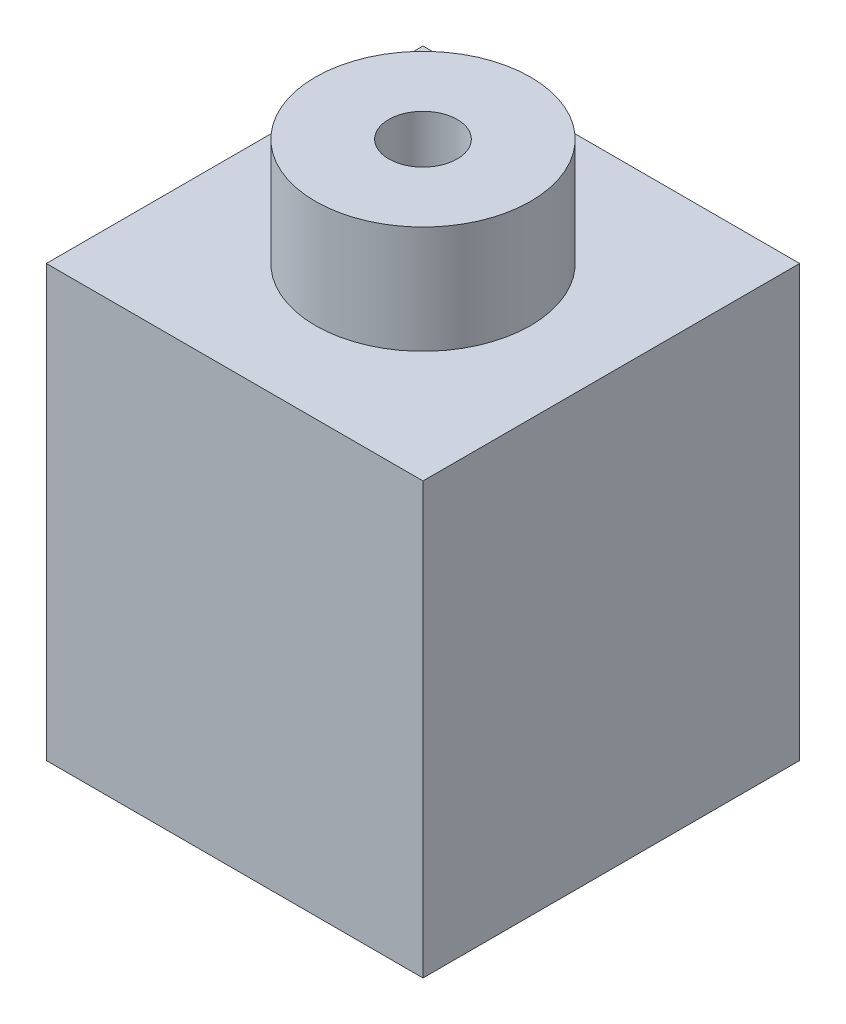
ISO-10303-21;
HEADER;
FILE_DESCRIPTION(('STEP AP214'),'2;1');
FILE_NAME('part.step','',(''),(''),'','','');
FILE_SCHEMA(('AUTOMOTIVE_DESIGN { 1 0 10303 214 1 1 1 1 }'));
ENDSEC;
DATA;
#1=APPLICATION_CONTEXT('core data for automotive mechanical design processes');
#2=APPLICATION_PROTOCOL_DEFINITION('international standard','automotive_design',2000,#1);
#3=PRODUCT_CONTEXT('',#1,'mechanical');
#4=PRODUCT('Part','Part','',(#3));
#5=PRODUCT_RELATED_PRODUCT_CATEGORY('part','',(#4));
#6=PRODUCT_DEFINITION_FORMATION('','',#4);
#7=PRODUCT_DEFINITION_CONTEXT('part definition',#1,'design');
#8=PRODUCT_DEFINITION('design','',#6,#7);
#9=PRODUCT_DEFINITION_SHAPE('','',#8);
#10=(LENGTH_UNIT() NAMED_UNIT(*) SI_UNIT(.MILLI.,.METRE.));
#11=(NAMED_UNIT(*) PLANE_ANGLE_UNIT() SI_UNIT($,.RADIAN.));
#12=(NAMED_UNIT(*) SI_UNIT($,.STERADIAN.) SOLID_ANGLE_UNIT());
#13=UNCERTAINTY_MEASURE_WITH_UNIT(LENGTH_MEASURE(1.E-05),#10,'distance_accuracy_value','');
#14=(GEOMETRIC_REPRESENTATION_CONTEXT(3) GLOBAL_UNCERTAINTY_ASSIGNED_CONTEXT((#13)) GLOBAL_UNIT_ASSIGNED_CONTEXT((#10,
#11,#12)) REPRESENTATION_CONTEXT('',''));
#15=CARTESIAN_POINT('',(0.,0.,0.));
#16=DIRECTION('',(0.,0.,1.));
#17=DIRECTION('',(1.,0.,0.));
#18=AXIS2_PLACEMENT_3D('',#15,#16,#17);
#19=CARTESIAN_POINT('',(0.,25.4,0.));
#20=DIRECTION('',(0.,-1.,0.));
#21=DIRECTION('',(0.,0.,-1.));
#22=AXIS2_PLACEMENT_3D('',#19,#20,#21);
#23=PLANE('',#22);
#24=DIRECTION('',(0.,0.,-1.));
#25=VECTOR('',#24,1.);
#26=CARTESIAN_POINT('',(11.1125,25.4,11.1125));
#27=LINE('',#26,#25);
#28=CARTESIAN_POINT('',(11.1125,25.4,11.1125));
#29=VERTEX_POINT('',#28);
#30=CARTESIAN_POINT('',(11.1125,25.4,-11.1125));
#31=VERTEX_POINT('',#30);
#32=EDGE_CURVE('E149',#29,#31,#27,.T.);
#33=ORIENTED_EDGE('',*,*,#32,.T.);
#34=DIRECTION('',(-1.,0.,0.));
#35=VECTOR('',#34,1.);
#36=CARTESIAN_POINT('',(-11.1125,25.4,-11.1125));
#37=LINE('',#36,#35);
#38=CARTESIAN_POINT('',(-11.1125,25.4,-11.1125));
#39=VERTEX_POINT('',#38);
#40=EDGE_CURVE('E90',#31,#39,#37,.T.);
#41=ORIENTED_EDGE('',*,*,#40,.T.);
#42=DIRECTION('',(0.,0.,1.));
#43=VECTOR('',#42,1.);
#44=CARTESIAN_POINT('',(-11.1125,25.4,11.1125));
#45=LINE('',#44,#43);
#46=CARTESIAN_POINT('',(-11.1125,25.4,11.1125));
#47=VERTEX_POINT('',#46);
#48=EDGE_CURVE('E152',#39,#47,#45,.T.);
#49=ORIENTED_EDGE('',*,*,#48,.T.);
#50=DIRECTION('',(1.,0.,0.));
#51=VECTOR('',#50,1.);
#52=CARTESIAN_POINT('',(-11.1125,25.4,11.1125));
#53=LINE('',#52,#51);
#54=EDGE_CURVE('E61',#47,#29,#53,.T.);
#55=ORIENTED_EDGE('',*,*,#54,.T.);
#56=EDGE_LOOP('',(#33,#41,#49,#55));
#57=FACE_BOUND('',#56,.T.);
#58=CARTESIAN_POINT('',(0.,25.4,0.));
#59=DIRECTION('',(0.,-1.,0.));
#60=DIRECTION('',(0.,0.,-1.));
#61=AXIS2_PLACEMENT_3D('',#58,#59,#60);
#62=CIRCLE('',#61,6.35);
#63=CARTESIAN_POINT('',(0.,25.4,-6.35));
#64=VERTEX_POINT('',#63);
#65=EDGE_CURVE('E45',#64,#64,#62,.F.);
#66=ORIENTED_EDGE('',*,*,#65,.F.);
#67=EDGE_LOOP('',(#66));
#68=FACE_BOUND('',#67,.T.);
#69=ADVANCED_FACE('F36',(#57,#68),#23,.F.);
#70=CARTESIAN_POINT('',(11.1125,25.4,11.1125));
#71=DIRECTION('',(-1.,0.,0.));
#72=DIRECTION('',(0.,0.,1.));
#73=AXIS2_PLACEMENT_3D('',#70,#71,#72);
#74=PLANE('',#73);
#75=DIRECTION('',(0.,0.,-1.));
#76=VECTOR('',#75,1.);
#77=CARTESIAN_POINT('',(11.1125,0.,11.1125));
#78=LINE('',#77,#76);
#79=CARTESIAN_POINT('',(11.1125,0.,11.1125));
#80=VERTEX_POINT('',#79);
#81=CARTESIAN_POINT('',(11.1125,0.,-11.1125));
#82=VERTEX_POINT('',#81);
#83=EDGE_CURVE('E148',#80,#82,#78,.T.);
#84=ORIENTED_EDGE('',*,*,#83,.T.);
#85=DIRECTION('',(0.,-1.,0.));
#86=VECTOR('',#85,1.);
#87=CARTESIAN_POINT('',(11.1125,25.4,-11.1125));
#88=LINE('',#87,#86);
#89=EDGE_CURVE('E169',#31,#82,#88,.T.);
#90=ORIENTED_EDGE('',*,*,#89,.F.);
#91=ORIENTED_EDGE('',*,*,#32,.F.);
#92=DIRECTION('',(0.,-1.,0.));
#93=VECTOR('',#92,1.);
#94=CARTESIAN_POINT('',(11.1125,25.4,11.1125));
#95=LINE('',#94,#93);
#96=EDGE_CURVE('E155',#29,#80,#95,.T.);
#97=ORIENTED_EDGE('',*,*,#96,.T.);
#98=EDGE_LOOP('',(#84,#90,#91,#97));
#99=FACE_BOUND('',#98,.T.);
#100=ADVANCED_FACE('F38',(#99),#74,.F.);
#101=CARTESIAN_POINT('',(-11.1125,25.4,-11.1125));
#102=DIRECTION('',(0.,0.,1.));
#103=DIRECTION('',(1.,0.,0.));
#104=AXIS2_PLACEMENT_3D('',#101,#102,#103);
#105=PLANE('',#104);
#106=DIRECTION('',(-1.,0.,0.));
#107=VECTOR('',#106,1.);
#108=CARTESIAN_POINT('',(-11.1125,0.,-11.1125));
#109=LINE('',#108,#107);
#110=CARTESIAN_POINT('',(-11.1125,0.,-11.1125));
#111=VERTEX_POINT('',#110);
#112=EDGE_CURVE('E158',#82,#111,#109,.T.);
#113=ORIENTED_EDGE('',*,*,#112,.T.);
#114=DIRECTION('',(0.,-1.,0.));
#115=VECTOR('',#114,1.);
#116=CARTESIAN_POINT('',(-11.1125,25.4,-11.1125));
#117=LINE('',#116,#115);
#118=EDGE_CURVE('E166',#39,#111,#117,.T.);
#119=ORIENTED_EDGE('',*,*,#118,.F.);
#120=ORIENTED_EDGE('',*,*,#40,.F.);
#121=ORIENTED_EDGE('',*,*,#89,.T.);
#122=EDGE_LOOP('',(#113,#119,#120,#121));
#123=FACE_BOUND('',#122,.T.);
#124=ADVANCED_FACE('F180',(#123),#105,.F.);
#125=CARTESIAN_POINT('',(-11.1125,25.4,11.1125));
#126=DIRECTION('',(1.,0.,0.));
#127=DIRECTION('',(0.,0.,-1.));
#128=AXIS2_PLACEMENT_3D('',#125,#126,#127);
#129=PLANE('',#128);
#130=DIRECTION('',(0.,0.,1.));
#131=VECTOR('',#130,1.);
#132=CARTESIAN_POINT('',(-11.1125,0.,11.1125));
#133=LINE('',#132,#131);
#134=CARTESIAN_POINT('',(-11.1125,0.,11.1125));
#135=VERTEX_POINT('',#134);
#136=EDGE_CURVE('E160',#111,#135,#133,.T.);
#137=ORIENTED_EDGE('',*,*,#136,.T.);
#138=DIRECTION('',(0.,-1.,0.));
#139=VECTOR('',#138,1.);
#140=CARTESIAN_POINT('',(-11.1125,25.4,11.1125));
#141=LINE('',#140,#139);
#142=EDGE_CURVE('E164',#47,#135,#141,.T.);
#143=ORIENTED_EDGE('',*,*,#142,.F.);
#144=ORIENTED_EDGE('',*,*,#48,.F.);
#145=ORIENTED_EDGE('',*,*,#118,.T.);
#146=EDGE_LOOP('',(#137,#143,#144,#145));
#147=FACE_BOUND('',#146,.T.);
#148=ADVANCED_FACE('F192',(#147),#129,.F.);
#149=CARTESIAN_POINT('',(-11.1125,25.4,11.1125));
#150=DIRECTION('',(0.,0.,-1.));
#151=DIRECTION('',(-1.,0.,0.));
#152=AXIS2_PLACEMENT_3D('',#149,#150,#151);
#153=PLANE('',#152);
#154=DIRECTION('',(1.,0.,0.));
#155=VECTOR('',#154,1.);
#156=CARTESIAN_POINT('',(-11.1125,0.,11.1125));
#157=LINE('',#156,#155);
#158=EDGE_CURVE('E82',#135,#80,#157,.T.);
#159=ORIENTED_EDGE('',*,*,#158,.T.);
#160=ORIENTED_EDGE('',*,*,#96,.F.);
#161=ORIENTED_EDGE('',*,*,#54,.F.);
#162=ORIENTED_EDGE('',*,*,#142,.T.);
#163=EDGE_LOOP('',(#159,#160,#161,#162));
#164=FACE_BOUND('',#163,.T.);
#165=ADVANCED_FACE('F188',(#164),#153,.F.);
#166=CARTESIAN_POINT('',(0.,0.,0.));
#167=DIRECTION('',(0.,-1.,0.));
#168=DIRECTION('',(0.,0.,-1.));
#169=AXIS2_PLACEMENT_3D('',#166,#167,#168);
#170=PLANE('',#169);
#171=ORIENTED_EDGE('',*,*,#83,.F.);
#172=ORIENTED_EDGE('',*,*,#158,.F.);
#173=ORIENTED_EDGE('',*,*,#136,.F.);
#174=ORIENTED_EDGE('',*,*,#112,.F.);
#175=EDGE_LOOP('',(#171,#172,#173,#174));
#176=FACE_BOUND('',#175,.T.);
#177=CARTESIAN_POINT('',(0.,0.,0.));
#178=DIRECTION('',(0.,1.,0.));
#179=DIRECTION('',(0.,0.,1.));
#180=AXIS2_PLACEMENT_3D('',#177,#178,#179);
#181=CIRCLE('',#180,2.01929999999999);
#182=CARTESIAN_POINT('',(0.,0.,2.01929999999999));
#183=VERTEX_POINT('',#182);
#184=EDGE_CURVE('E142',#183,#183,#181,.T.);
#185=ORIENTED_EDGE('',*,*,#184,.T.);
#186=EDGE_LOOP('',(#185));
#187=FACE_BOUND('',#186,.T.);
#188=ADVANCED_FACE('F185',(#176,#187),#170,.T.);
#189=CARTESIAN_POINT('',(0.,31.75,0.));
#190=DIRECTION('',(0.,-1.,0.));
#191=DIRECTION('',(0.,0.,-1.));
#192=AXIS2_PLACEMENT_3D('',#189,#190,#191);
#193=CYLINDRICAL_SURFACE('',#192,6.35);
#194=CARTESIAN_POINT('',(0.,31.75,0.));
#195=DIRECTION('',(0.,1.,0.));
#196=DIRECTION('',(0.,0.,1.));
#197=AXIS2_PLACEMENT_3D('',#194,#195,#196);
#198=CIRCLE('',#197,6.35);
#199=CARTESIAN_POINT('',(0.,31.75,6.35));
#200=VERTEX_POINT('',#199);
#201=EDGE_CURVE('E145',#200,#200,#198,.T.);
#202=ORIENTED_EDGE('',*,*,#201,.F.);
#203=EDGE_LOOP('',(#202));
#204=FACE_BOUND('',#203,.T.);
#205=ORIENTED_EDGE('',*,*,#65,.T.);
#206=EDGE_LOOP('',(#205));
#207=FACE_BOUND('',#206,.T.);
#208=ADVANCED_FACE('F173',(#204,#207),#193,.T.);
#209=CARTESIAN_POINT('',(0.,31.75,0.));
#210=DIRECTION('',(0.,1.,0.));
#211=DIRECTION('',(0.,0.,1.));
#212=AXIS2_PLACEMENT_3D('',#209,#210,#211);
#213=PLANE('',#212);
#214=CARTESIAN_POINT('',(0.,31.75,0.));
#215=DIRECTION('',(0.,1.,0.));
#216=DIRECTION('',(0.,0.,1.));
#217=AXIS2_PLACEMENT_3D('',#214,#215,#216);
#218=CIRCLE('',#217,2.01929999999999);
#219=CARTESIAN_POINT('',(0.,31.75,2.01929999999999));
#220=VERTEX_POINT('',#219);
#221=EDGE_CURVE('E132',#220,#220,#218,.T.);
#222=ORIENTED_EDGE('',*,*,#221,.F.);
#223=EDGE_LOOP('',(#222));
#224=FACE_BOUND('',#223,.T.);
#225=ORIENTED_EDGE('',*,*,#201,.T.);
#226=EDGE_LOOP('',(#225));
#227=FACE_BOUND('',#226,.T.);
#228=ADVANCED_FACE('F210',(#224,#227),#213,.T.);
#229=CARTESIAN_POINT('',(0.,31.75,0.));
#230=DIRECTION('',(0.,1.,0.));
#231=DIRECTION('',(0.,0.,1.));
#232=AXIS2_PLACEMENT_3D('',#229,#230,#231);
#233=CYLINDRICAL_SURFACE('',#232,2.01929999999999);
#234=ORIENTED_EDGE('',*,*,#184,.F.);
#235=EDGE_LOOP('',(#234));
#236=FACE_BOUND('',#235,.T.);
#237=ORIENTED_EDGE('',*,*,#221,.T.);
#238=EDGE_LOOP('',(#237));
#239=FACE_BOUND('',#238,.T.);
#240=ADVANCED_FACE('F207',(#236,#239),#233,.F.);
#241=CLOSED_SHELL('',(#69,#100,#124,#148,#165,#188,#208,#228,#240));
#242=CARTESIAN_POINT('',(0.,3.81,0.));
#243=DIRECTION('',(0.,1.,0.));
#244=DIRECTION('',(0.,0.,1.));
#245=AXIS2_PLACEMENT_3D('',#242,#243,#244);
#246=PLANE('',#245);
#247=CARTESIAN_POINT('',(0.,3.81,0.));
#248=DIRECTION('',(0.,1.,0.));
#249=DIRECTION('',(0.,0.,1.));
#250=AXIS2_PLACEMENT_3D('',#247,#248,#249);
#251=CIRCLE('',#250,5.19429999999943);
#252=CARTESIAN_POINT('',(0.,3.81,5.19429999999943));
#253=VERTEX_POINT('',#252);
#254=EDGE_CURVE('E11',#253,#253,#251,.F.);
#255=ORIENTED_EDGE('',*,*,#254,.T.);
#256=EDGE_LOOP('',(#255));
#257=FACE_BOUND('',#256,.T.);
#258=DIRECTION('',(0.,0.,-1.));
#259=VECTOR('',#258,1.);
#260=CARTESIAN_POINT('',(-8.5725,3.81,-8.5725));
#261=LINE('',#260,#259);
#262=CARTESIAN_POINT('',(-8.5725,3.81,8.5725));
#263=VERTEX_POINT('',#262);
#264=CARTESIAN_POINT('',(-8.5725,3.81,-8.5725));
#265=VERTEX_POINT('',#264);
#266=EDGE_CURVE('E52',#263,#265,#261,.T.);
#267=ORIENTED_EDGE('',*,*,#266,.F.);
#268=DIRECTION('',(-1.,0.,0.));
#269=VECTOR('',#268,1.);
#270=CARTESIAN_POINT('',(-8.5725,3.81,8.57250000000001));
#271=LINE('',#270,#269);
#272=CARTESIAN_POINT('',(8.5725,3.81,8.5725));
#273=VERTEX_POINT('',#272);
#274=EDGE_CURVE('E346',#273,#263,#271,.T.);
#275=ORIENTED_EDGE('',*,*,#274,.F.);
#276=DIRECTION('',(0.,0.,1.));
#277=VECTOR('',#276,1.);
#278=CARTESIAN_POINT('',(8.57250000000001,3.81,-8.5725));
#279=LINE('',#278,#277);
#280=CARTESIAN_POINT('',(8.57250000000001,3.81,-8.5725));
#281=VERTEX_POINT('',#280);
#282=EDGE_CURVE('E113',#281,#273,#279,.T.);
#283=ORIENTED_EDGE('',*,*,#282,.F.);
#284=DIRECTION('',(1.,0.,0.));
#285=VECTOR('',#284,1.);
#286=CARTESIAN_POINT('',(-8.5725,3.81,-8.5725));
#287=LINE('',#286,#285);
#288=EDGE_CURVE('E110',#265,#281,#287,.T.);
#289=ORIENTED_EDGE('',*,*,#288,.F.);
#290=EDGE_LOOP('',(#267,#275,#283,#289));
#291=FACE_BOUND('',#290,.T.);
#292=ADVANCED_FACE('F111',(#257,#291),#246,.T.);
#293=CARTESIAN_POINT('',(-8.5725,21.59,8.5725));
#294=DIRECTION('',(0.,0.,1.));
#295=DIRECTION('',(1.,0.,0.));
#296=AXIS2_PLACEMENT_3D('',#293,#294,#295);
#297=PLANE('',#296);
#298=DIRECTION('',(0.,-1.,0.));
#299=VECTOR('',#298,1.);
#300=CARTESIAN_POINT('',(8.5725,21.59,8.5725));
#301=LINE('',#300,#299);
#302=CARTESIAN_POINT('',(8.5725,21.59,8.5725));
#303=VERTEX_POINT('',#302);
#304=EDGE_CURVE('E134',#303,#273,#301,.T.);
#305=ORIENTED_EDGE('',*,*,#304,.T.);
#306=ORIENTED_EDGE('',*,*,#274,.T.);
#307=DIRECTION('',(0.,-1.,0.));
#308=VECTOR('',#307,1.);
#309=CARTESIAN_POINT('',(-8.5725,21.59,8.5725));
#310=LINE('',#309,#308);
#311=CARTESIAN_POINT('',(-8.5725,21.59,8.5725));
#312=VERTEX_POINT('',#311);
#313=EDGE_CURVE('E124',#312,#263,#310,.T.);
#314=ORIENTED_EDGE('',*,*,#313,.F.);
#315=DIRECTION('',(-1.,0.,0.));
#316=VECTOR('',#315,1.);
#317=CARTESIAN_POINT('',(-8.5725,21.59,8.5725));
#318=LINE('',#317,#316);
#319=EDGE_CURVE('E349',#303,#312,#318,.T.);
#320=ORIENTED_EDGE('',*,*,#319,.F.);
#321=EDGE_LOOP('',(#305,#306,#314,#320));
#322=FACE_BOUND('',#321,.T.);
#323=ADVANCED_FACE('F242',(#322),#297,.F.);
#324=CARTESIAN_POINT('',(-8.5725,21.59,-8.5725));
#325=DIRECTION('',(-1.,0.,0.));
#326=DIRECTION('',(0.,0.,1.));
#327=AXIS2_PLACEMENT_3D('',#324,#325,#326);
#328=PLANE('',#327);
#329=ORIENTED_EDGE('',*,*,#313,.T.);
#330=ORIENTED_EDGE('',*,*,#266,.T.);
#331=DIRECTION('',(0.,-1.,0.));
#332=VECTOR('',#331,1.);
#333=CARTESIAN_POINT('',(-8.5725,21.59,-8.5725));
#334=LINE('',#333,#332);
#335=CARTESIAN_POINT('',(-8.5725,21.59,-8.5725));
#336=VERTEX_POINT('',#335);
#337=EDGE_CURVE('E122',#336,#265,#334,.T.);
#338=ORIENTED_EDGE('',*,*,#337,.F.);
#339=DIRECTION('',(0.,0.,-1.));
#340=VECTOR('',#339,1.);
#341=CARTESIAN_POINT('',(-8.5725,21.59,-8.5725));
#342=LINE('',#341,#340);
#343=EDGE_CURVE('E356',#312,#336,#342,.T.);
#344=ORIENTED_EDGE('',*,*,#343,.F.);
#345=EDGE_LOOP('',(#329,#330,#338,#344));
#346=FACE_BOUND('',#345,.T.);
#347=ADVANCED_FACE('F120',(#346),#328,.F.);
#348=CARTESIAN_POINT('',(-8.5725,21.59,-8.5725));
#349=DIRECTION('',(0.,0.,-1.));
#350=DIRECTION('',(-1.,0.,0.));
#351=AXIS2_PLACEMENT_3D('',#348,#349,#350);
#352=PLANE('',#351);
#353=ORIENTED_EDGE('',*,*,#337,.T.);
#354=ORIENTED_EDGE('',*,*,#288,.T.);
#355=DIRECTION('',(0.,-1.,0.));
#356=VECTOR('',#355,1.);
#357=CARTESIAN_POINT('',(8.5725,21.59,-8.5725));
#358=LINE('',#357,#356);
#359=CARTESIAN_POINT('',(8.5725,21.59,-8.5725));
#360=VERTEX_POINT('',#359);
#361=EDGE_CURVE('E130',#360,#281,#358,.T.);
#362=ORIENTED_EDGE('',*,*,#361,.F.);
#363=DIRECTION('',(1.,0.,0.));
#364=VECTOR('',#363,1.);
#365=CARTESIAN_POINT('',(-8.5725,21.59,-8.5725));
#366=LINE('',#365,#364);
#367=EDGE_CURVE('E129',#336,#360,#366,.T.);
#368=ORIENTED_EDGE('',*,*,#367,.F.);
#369=EDGE_LOOP('',(#353,#354,#362,#368));
#370=FACE_BOUND('',#369,.T.);
#371=ADVANCED_FACE('F127',(#370),#352,.F.);
#372=CARTESIAN_POINT('',(8.5725,21.59,-8.5725));
#373=DIRECTION('',(1.,0.,0.));
#374=DIRECTION('',(0.,0.,-1.));
#375=AXIS2_PLACEMENT_3D('',#372,#373,#374);
#376=PLANE('',#375);
#377=ORIENTED_EDGE('',*,*,#361,.T.);
#378=ORIENTED_EDGE('',*,*,#282,.T.);
#379=ORIENTED_EDGE('',*,*,#304,.F.);
#380=DIRECTION('',(0.,0.,1.));
#381=VECTOR('',#380,1.);
#382=CARTESIAN_POINT('',(8.5725,21.59,-8.5725));
#383=LINE('',#382,#381);
#384=EDGE_CURVE('E345',#360,#303,#383,.T.);
#385=ORIENTED_EDGE('',*,*,#384,.F.);
#386=EDGE_LOOP('',(#377,#378,#379,#385));
#387=FACE_BOUND('',#386,.T.);
#388=ADVANCED_FACE('F264',(#387),#376,.F.);
#389=CARTESIAN_POINT('',(0.,21.59,0.));
#390=DIRECTION('',(0.,1.,0.));
#391=DIRECTION('',(0.,0.,1.));
#392=AXIS2_PLACEMENT_3D('',#389,#390,#391);
#393=PLANE('',#392);
#394=CARTESIAN_POINT('',(0.,21.59,0.));
#395=DIRECTION('',(0.,-1.,0.));
#396=DIRECTION('',(0.,0.,-1.));
#397=AXIS2_PLACEMENT_3D('',#394,#395,#396);
#398=CIRCLE('',#397,5.19429999999943);
#399=CARTESIAN_POINT('',(0.,21.59,-5.19429999999943));
#400=VERTEX_POINT('',#399);
#401=EDGE_CURVE('E344',#400,#400,#398,.T.);
#402=ORIENTED_EDGE('',*,*,#401,.F.);
#403=EDGE_LOOP('',(#402));
#404=FACE_BOUND('',#403,.T.);
#405=ORIENTED_EDGE('',*,*,#384,.T.);
#406=ORIENTED_EDGE('',*,*,#319,.T.);
#407=ORIENTED_EDGE('',*,*,#343,.T.);
#408=ORIENTED_EDGE('',*,*,#367,.T.);
#409=EDGE_LOOP('',(#405,#406,#407,#408));
#410=FACE_BOUND('',#409,.T.);
#411=ADVANCED_FACE('F271',(#404,#410),#393,.F.);
#412=CARTESIAN_POINT('',(0.,21.59,0.));
#413=DIRECTION('',(0.,-1.,0.));
#414=DIRECTION('',(0.,0.,-1.));
#415=AXIS2_PLACEMENT_3D('',#412,#413,#414);
#416=CYLINDRICAL_SURFACE('',#415,5.19429999999943);
#417=ORIENTED_EDGE('',*,*,#254,.F.);
#418=EDGE_LOOP('',(#417));
#419=FACE_BOUND('',#418,.T.);
#420=ORIENTED_EDGE('',*,*,#401,.T.);
#421=EDGE_LOOP('',(#420));
#422=FACE_BOUND('',#421,.T.);
#423=ADVANCED_FACE('F279',(#419,#422),#416,.T.);
#424=CLOSED_SHELL('',(#292,#323,#347,#371,#388,#411,#423));
#425=ORIENTED_CLOSED_SHELL('',*,#424,.T.);
#426=BREP_WITH_VOIDS('B2',#241,(#425));
#427=ADVANCED_BREP_SHAPE_REPRESENTATION('',(#18,#426),#14);
#428=SHAPE_DEFINITION_REPRESENTATION(#9,#427);
ENDSEC;
END-ISO-10303-21;
